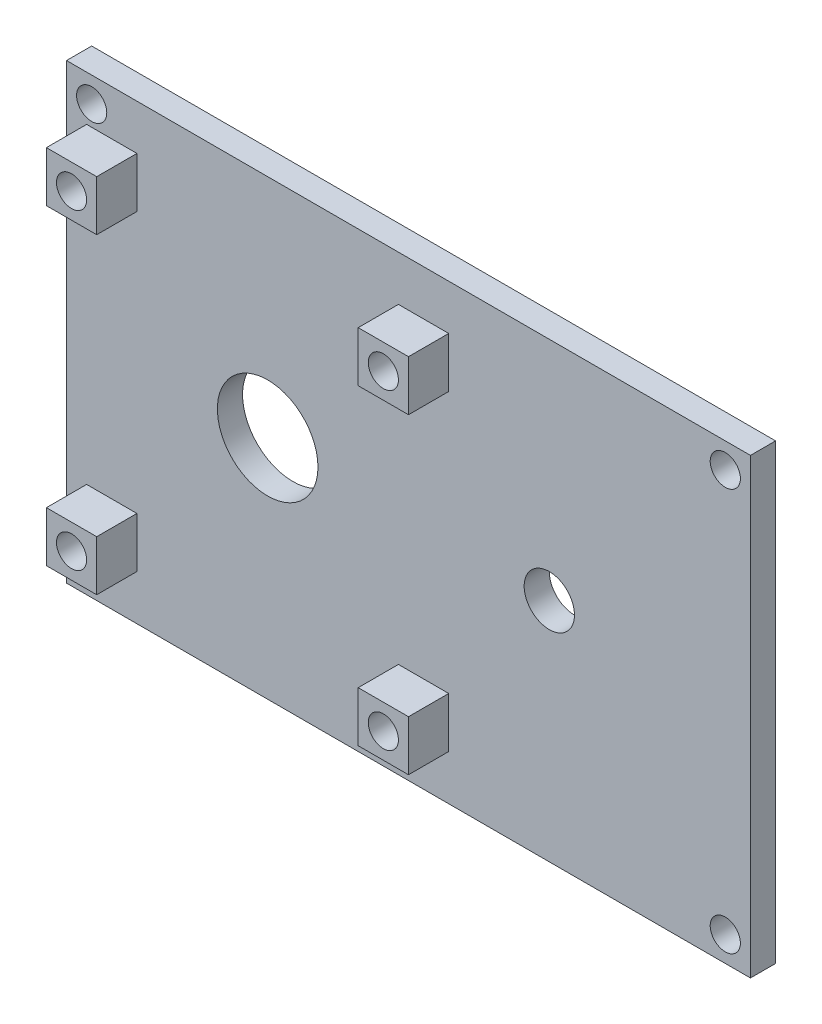
ISO-10303-21;
HEADER;
FILE_DESCRIPTION(('STEP AP214'),'2;1');
FILE_NAME('part.step','',(''),(''),'','','');
FILE_SCHEMA(('AUTOMOTIVE_DESIGN { 1 0 10303 214 1 1 1 1 }'));
ENDSEC;
DATA;
#1=APPLICATION_CONTEXT('core data for automotive mechanical design processes');
#2=APPLICATION_PROTOCOL_DEFINITION('international standard','automotive_design',2000,#1);
#3=PRODUCT_CONTEXT('',#1,'mechanical');
#4=PRODUCT('Part','Part','',(#3));
#5=PRODUCT_RELATED_PRODUCT_CATEGORY('part','',(#4));
#6=PRODUCT_DEFINITION_FORMATION('','',#4);
#7=PRODUCT_DEFINITION_CONTEXT('part definition',#1,'design');
#8=PRODUCT_DEFINITION('design','',#6,#7);
#9=PRODUCT_DEFINITION_SHAPE('','',#8);
#10=(LENGTH_UNIT() NAMED_UNIT(*) SI_UNIT(.MILLI.,.METRE.));
#11=(NAMED_UNIT(*) PLANE_ANGLE_UNIT() SI_UNIT($,.RADIAN.));
#12=(NAMED_UNIT(*) SI_UNIT($,.STERADIAN.) SOLID_ANGLE_UNIT());
#13=UNCERTAINTY_MEASURE_WITH_UNIT(LENGTH_MEASURE(1.E-05),#10,'distance_accuracy_value','');
#14=(GEOMETRIC_REPRESENTATION_CONTEXT(3) GLOBAL_UNCERTAINTY_ASSIGNED_CONTEXT((#13)) GLOBAL_UNIT_ASSIGNED_CONTEXT((#10,
#11,#12)) REPRESENTATION_CONTEXT('',''));
#15=CARTESIAN_POINT('',(0.,0.,0.));
#16=DIRECTION('',(0.,0.,1.));
#17=DIRECTION('',(1.,0.,0.));
#18=AXIS2_PLACEMENT_3D('',#15,#16,#17);
#19=CARTESIAN_POINT('',(0.,-22.5,2.5));
#20=DIRECTION('',(0.,1.,0.));
#21=DIRECTION('',(0.,0.,1.));
#22=AXIS2_PLACEMENT_3D('',#19,#20,#21);
#23=PLANE('',#22);
#24=DIRECTION('',(1.,0.,0.));
#25=VECTOR('',#24,1.);
#26=CARTESIAN_POINT('',(0.,-22.5,0.));
#27=LINE('',#26,#25);
#28=CARTESIAN_POINT('',(-34.,-22.5,0.));
#29=VERTEX_POINT('',#28);
#30=CARTESIAN_POINT('',(34.,-22.5,0.));
#31=VERTEX_POINT('',#30);
#32=EDGE_CURVE('E349',#29,#31,#27,.T.);
#33=ORIENTED_EDGE('',*,*,#32,.T.);
#34=DIRECTION('',(0.,0.,-1.));
#35=VECTOR('',#34,1.);
#36=CARTESIAN_POINT('',(34.,-22.5,2.5));
#37=LINE('',#36,#35);
#38=CARTESIAN_POINT('',(34.,-22.5,2.5));
#39=VERTEX_POINT('',#38);
#40=EDGE_CURVE('E365',#39,#31,#37,.T.);
#41=ORIENTED_EDGE('',*,*,#40,.F.);
#42=DIRECTION('',(1.,0.,0.));
#43=VECTOR('',#42,1.);
#44=CARTESIAN_POINT('',(0.,-22.5,2.5));
#45=LINE('',#44,#43);
#46=CARTESIAN_POINT('',(-34.,-22.5,2.5));
#47=VERTEX_POINT('',#46);
#48=EDGE_CURVE('E320',#47,#39,#45,.T.);
#49=ORIENTED_EDGE('',*,*,#48,.F.);
#50=DIRECTION('',(0.,0.,-1.));
#51=VECTOR('',#50,1.);
#52=CARTESIAN_POINT('',(-34.,-22.5,2.5));
#53=LINE('',#52,#51);
#54=EDGE_CURVE('E331',#47,#29,#53,.T.);
#55=ORIENTED_EDGE('',*,*,#54,.T.);
#56=EDGE_LOOP('',(#33,#41,#49,#55));
#57=FACE_BOUND('',#56,.T.);
#58=ADVANCED_FACE('F37',(#57),#23,.F.);
#59=CARTESIAN_POINT('',(34.,0.,2.5));
#60=DIRECTION('',(-1.,0.,0.));
#61=DIRECTION('',(0.,-1.,0.));
#62=AXIS2_PLACEMENT_3D('',#59,#60,#61);
#63=PLANE('',#62);
#64=DIRECTION('',(0.,1.,0.));
#65=VECTOR('',#64,1.);
#66=CARTESIAN_POINT('',(34.,0.,0.));
#67=LINE('',#66,#65);
#68=CARTESIAN_POINT('',(34.,22.5,0.));
#69=VERTEX_POINT('',#68);
#70=EDGE_CURVE('E352',#31,#69,#67,.T.);
#71=ORIENTED_EDGE('',*,*,#70,.T.);
#72=DIRECTION('',(0.,0.,-1.));
#73=VECTOR('',#72,1.);
#74=CARTESIAN_POINT('',(34.,22.5,2.5));
#75=LINE('',#74,#73);
#76=CARTESIAN_POINT('',(34.,22.5,2.5));
#77=VERTEX_POINT('',#76);
#78=EDGE_CURVE('E363',#77,#69,#75,.T.);
#79=ORIENTED_EDGE('',*,*,#78,.F.);
#80=DIRECTION('',(0.,1.,0.));
#81=VECTOR('',#80,1.);
#82=CARTESIAN_POINT('',(34.,0.,2.5));
#83=LINE('',#82,#81);
#84=EDGE_CURVE('E323',#39,#77,#83,.T.);
#85=ORIENTED_EDGE('',*,*,#84,.F.);
#86=ORIENTED_EDGE('',*,*,#40,.T.);
#87=EDGE_LOOP('',(#71,#79,#85,#86));
#88=FACE_BOUND('',#87,.T.);
#89=ADVANCED_FACE('F432',(#88),#63,.F.);
#90=CARTESIAN_POINT('',(0.,22.5,2.5));
#91=DIRECTION('',(0.,1.,0.));
#92=DIRECTION('',(-1.,0.,0.));
#93=AXIS2_PLACEMENT_3D('',#90,#91,#92);
#94=PLANE('',#93);
#95=DIRECTION('',(1.,0.,0.));
#96=VECTOR('',#95,1.);
#97=CARTESIAN_POINT('',(0.,22.5,0.));
#98=LINE('',#97,#96);
#99=CARTESIAN_POINT('',(-34.,22.5,0.));
#100=VERTEX_POINT('',#99);
#101=EDGE_CURVE('E355',#100,#69,#98,.T.);
#102=ORIENTED_EDGE('',*,*,#101,.F.);
#103=DIRECTION('',(0.,0.,-1.));
#104=VECTOR('',#103,1.);
#105=CARTESIAN_POINT('',(-34.,22.5,2.5));
#106=LINE('',#105,#104);
#107=CARTESIAN_POINT('',(-34.,22.5,2.5));
#108=VERTEX_POINT('',#107);
#109=EDGE_CURVE('E361',#108,#100,#106,.T.);
#110=ORIENTED_EDGE('',*,*,#109,.F.);
#111=DIRECTION('',(1.,0.,0.));
#112=VECTOR('',#111,1.);
#113=CARTESIAN_POINT('',(0.,22.5,2.5));
#114=LINE('',#113,#112);
#115=EDGE_CURVE('E325',#108,#77,#114,.T.);
#116=ORIENTED_EDGE('',*,*,#115,.T.);
#117=ORIENTED_EDGE('',*,*,#78,.T.);
#118=EDGE_LOOP('',(#102,#110,#116,#117));
#119=FACE_BOUND('',#118,.T.);
#120=ADVANCED_FACE('F429',(#119),#94,.T.);
#121=CARTESIAN_POINT('',(-31.5,20.,2.5));
#122=DIRECTION('',(0.,0.,-1.));
#123=DIRECTION('',(-1.,0.,0.));
#124=AXIS2_PLACEMENT_3D('',#121,#122,#123);
#125=CYLINDRICAL_SURFACE('',#124,1.5);
#126=CARTESIAN_POINT('',(-31.5,20.,2.5));
#127=DIRECTION('',(0.,0.,1.));
#128=DIRECTION('',(1.,0.,0.));
#129=AXIS2_PLACEMENT_3D('',#126,#127,#128);
#130=CIRCLE('',#129,1.5);
#131=CARTESIAN_POINT('',(-30.,20.,2.5));
#132=VERTEX_POINT('',#131);
#133=EDGE_CURVE('E317',#132,#132,#130,.T.);
#134=ORIENTED_EDGE('',*,*,#133,.T.);
#135=EDGE_LOOP('',(#134));
#136=FACE_BOUND('',#135,.T.);
#137=CARTESIAN_POINT('',(-31.5,20.,0.));
#138=DIRECTION('',(0.,0.,1.));
#139=DIRECTION('',(1.,0.,0.));
#140=AXIS2_PLACEMENT_3D('',#137,#138,#139);
#141=CIRCLE('',#140,1.5);
#142=CARTESIAN_POINT('',(-30.,20.,0.));
#143=VERTEX_POINT('',#142);
#144=EDGE_CURVE('E346',#143,#143,#141,.T.);
#145=ORIENTED_EDGE('',*,*,#144,.F.);
#146=EDGE_LOOP('',(#145));
#147=FACE_BOUND('',#146,.T.);
#148=ADVANCED_FACE('F452',(#136,#147),#125,.F.);
#149=CARTESIAN_POINT('',(31.5,20.,2.5));
#150=DIRECTION('',(0.,0.,-1.));
#151=DIRECTION('',(-1.,0.,0.));
#152=AXIS2_PLACEMENT_3D('',#149,#150,#151);
#153=CYLINDRICAL_SURFACE('',#152,1.5);
#154=CARTESIAN_POINT('',(31.5,20.,2.5));
#155=DIRECTION('',(0.,0.,1.));
#156=DIRECTION('',(1.,0.,0.));
#157=AXIS2_PLACEMENT_3D('',#154,#155,#156);
#158=CIRCLE('',#157,1.5);
#159=CARTESIAN_POINT('',(33.,20.,2.5));
#160=VERTEX_POINT('',#159);
#161=EDGE_CURVE('E314',#160,#160,#158,.T.);
#162=ORIENTED_EDGE('',*,*,#161,.T.);
#163=EDGE_LOOP('',(#162));
#164=FACE_BOUND('',#163,.T.);
#165=CARTESIAN_POINT('',(31.5,20.,0.));
#166=DIRECTION('',(0.,0.,1.));
#167=DIRECTION('',(1.,0.,0.));
#168=AXIS2_PLACEMENT_3D('',#165,#166,#167);
#169=CIRCLE('',#168,1.5);
#170=CARTESIAN_POINT('',(33.,20.,0.));
#171=VERTEX_POINT('',#170);
#172=EDGE_CURVE('E343',#171,#171,#169,.T.);
#173=ORIENTED_EDGE('',*,*,#172,.F.);
#174=EDGE_LOOP('',(#173));
#175=FACE_BOUND('',#174,.T.);
#176=ADVANCED_FACE('F455',(#164,#175),#153,.F.);
#177=CARTESIAN_POINT('',(31.5,-20.,2.5));
#178=DIRECTION('',(0.,0.,-1.));
#179=DIRECTION('',(-1.,0.,0.));
#180=AXIS2_PLACEMENT_3D('',#177,#178,#179);
#181=CYLINDRICAL_SURFACE('',#180,1.5);
#182=CARTESIAN_POINT('',(31.5,-20.,2.5));
#183=DIRECTION('',(0.,0.,1.));
#184=DIRECTION('',(1.,0.,0.));
#185=AXIS2_PLACEMENT_3D('',#182,#183,#184);
#186=CIRCLE('',#185,1.5);
#187=CARTESIAN_POINT('',(33.,-20.,2.5));
#188=VERTEX_POINT('',#187);
#189=EDGE_CURVE('E311',#188,#188,#186,.T.);
#190=ORIENTED_EDGE('',*,*,#189,.T.);
#191=EDGE_LOOP('',(#190));
#192=FACE_BOUND('',#191,.T.);
#193=CARTESIAN_POINT('',(31.5,-20.,0.));
#194=DIRECTION('',(0.,0.,1.));
#195=DIRECTION('',(1.,0.,0.));
#196=AXIS2_PLACEMENT_3D('',#193,#194,#195);
#197=CIRCLE('',#196,1.5);
#198=CARTESIAN_POINT('',(33.,-20.,0.));
#199=VERTEX_POINT('',#198);
#200=EDGE_CURVE('E340',#199,#199,#197,.T.);
#201=ORIENTED_EDGE('',*,*,#200,.F.);
#202=EDGE_LOOP('',(#201));
#203=FACE_BOUND('',#202,.T.);
#204=ADVANCED_FACE('F459',(#192,#203),#181,.F.);
#205=CARTESIAN_POINT('',(-31.5,-20.,2.5));
#206=DIRECTION('',(0.,0.,-1.));
#207=DIRECTION('',(-1.,0.,0.));
#208=AXIS2_PLACEMENT_3D('',#205,#206,#207);
#209=CYLINDRICAL_SURFACE('',#208,1.5);
#210=CARTESIAN_POINT('',(-31.5,-20.,2.5));
#211=DIRECTION('',(0.,0.,1.));
#212=DIRECTION('',(1.,0.,0.));
#213=AXIS2_PLACEMENT_3D('',#210,#211,#212);
#214=CIRCLE('',#213,1.5);
#215=CARTESIAN_POINT('',(-30.,-20.,2.5));
#216=VERTEX_POINT('',#215);
#217=EDGE_CURVE('E308',#216,#216,#214,.T.);
#218=ORIENTED_EDGE('',*,*,#217,.T.);
#219=EDGE_LOOP('',(#218));
#220=FACE_BOUND('',#219,.T.);
#221=CARTESIAN_POINT('',(-31.5,-20.,0.));
#222=DIRECTION('',(0.,0.,1.));
#223=DIRECTION('',(1.,0.,0.));
#224=AXIS2_PLACEMENT_3D('',#221,#222,#223);
#225=CIRCLE('',#224,1.5);
#226=CARTESIAN_POINT('',(-30.,-20.,0.));
#227=VERTEX_POINT('',#226);
#228=EDGE_CURVE('E337',#227,#227,#225,.T.);
#229=ORIENTED_EDGE('',*,*,#228,.F.);
#230=EDGE_LOOP('',(#229));
#231=FACE_BOUND('',#230,.T.);
#232=ADVANCED_FACE('F463',(#220,#231),#209,.F.);
#233=CARTESIAN_POINT('',(-14.,0.,2.5));
#234=DIRECTION('',(0.,0.,-1.));
#235=DIRECTION('',(-1.,0.,0.));
#236=AXIS2_PLACEMENT_3D('',#233,#234,#235);
#237=CYLINDRICAL_SURFACE('',#236,5.);
#238=CARTESIAN_POINT('',(-14.,0.,2.5));
#239=DIRECTION('',(0.,0.,1.));
#240=DIRECTION('',(1.,0.,0.));
#241=AXIS2_PLACEMENT_3D('',#238,#239,#240);
#242=CIRCLE('',#241,5.);
#243=CARTESIAN_POINT('',(-8.99999999999997,0.,2.5));
#244=VERTEX_POINT('',#243);
#245=EDGE_CURVE('E304',#244,#244,#242,.T.);
#246=ORIENTED_EDGE('',*,*,#245,.T.);
#247=EDGE_LOOP('',(#246));
#248=FACE_BOUND('',#247,.T.);
#249=CARTESIAN_POINT('',(-14.,0.,0.));
#250=DIRECTION('',(0.,0.,1.));
#251=DIRECTION('',(1.,0.,0.));
#252=AXIS2_PLACEMENT_3D('',#249,#250,#251);
#253=CIRCLE('',#252,5.);
#254=CARTESIAN_POINT('',(-8.99999999999997,0.,0.));
#255=VERTEX_POINT('',#254);
#256=EDGE_CURVE('E334',#255,#255,#253,.T.);
#257=ORIENTED_EDGE('',*,*,#256,.F.);
#258=EDGE_LOOP('',(#257));
#259=FACE_BOUND('',#258,.T.);
#260=ADVANCED_FACE('F467',(#248,#259),#237,.F.);
#261=CARTESIAN_POINT('',(14.,0.,2.5));
#262=DIRECTION('',(0.,0.,-1.));
#263=DIRECTION('',(-1.,0.,0.));
#264=AXIS2_PLACEMENT_3D('',#261,#262,#263);
#265=CYLINDRICAL_SURFACE('',#264,2.5);
#266=CARTESIAN_POINT('',(14.,0.,2.5));
#267=DIRECTION('',(0.,0.,1.));
#268=DIRECTION('',(1.,0.,0.));
#269=AXIS2_PLACEMENT_3D('',#266,#267,#268);
#270=CIRCLE('',#269,2.5);
#271=CARTESIAN_POINT('',(16.5,0.,2.5));
#272=VERTEX_POINT('',#271);
#273=EDGE_CURVE('E301',#272,#272,#270,.T.);
#274=ORIENTED_EDGE('',*,*,#273,.T.);
#275=EDGE_LOOP('',(#274));
#276=FACE_BOUND('',#275,.T.);
#277=CARTESIAN_POINT('',(14.,0.,0.));
#278=DIRECTION('',(0.,0.,1.));
#279=DIRECTION('',(1.,0.,0.));
#280=AXIS2_PLACEMENT_3D('',#277,#278,#279);
#281=CIRCLE('',#280,2.5);
#282=CARTESIAN_POINT('',(16.5,0.,0.));
#283=VERTEX_POINT('',#282);
#284=EDGE_CURVE('E300',#283,#283,#281,.T.);
#285=ORIENTED_EDGE('',*,*,#284,.F.);
#286=EDGE_LOOP('',(#285));
#287=FACE_BOUND('',#286,.T.);
#288=ADVANCED_FACE('F440',(#276,#287),#265,.F.);
#289=CARTESIAN_POINT('',(-34.,0.,2.5));
#290=DIRECTION('',(-1.,0.,0.));
#291=DIRECTION('',(0.,-1.,0.));
#292=AXIS2_PLACEMENT_3D('',#289,#290,#291);
#293=PLANE('',#292);
#294=DIRECTION('',(0.,1.,0.));
#295=VECTOR('',#294,1.);
#296=CARTESIAN_POINT('',(-34.,0.,0.));
#297=LINE('',#296,#295);
#298=EDGE_CURVE('E305',#29,#100,#297,.T.);
#299=ORIENTED_EDGE('',*,*,#298,.F.);
#300=ORIENTED_EDGE('',*,*,#54,.F.);
#301=DIRECTION('',(0.,1.,0.));
#302=VECTOR('',#301,1.);
#303=CARTESIAN_POINT('',(-34.,0.,2.5));
#304=LINE('',#303,#302);
#305=EDGE_CURVE('E328',#47,#108,#304,.T.);
#306=ORIENTED_EDGE('',*,*,#305,.T.);
#307=ORIENTED_EDGE('',*,*,#109,.T.);
#308=EDGE_LOOP('',(#299,#300,#306,#307));
#309=FACE_BOUND('',#308,.T.);
#310=ADVANCED_FACE('F423',(#309),#293,.T.);
#311=CARTESIAN_POINT('',(0.,0.,2.5));
#312=DIRECTION('',(0.,0.,1.));
#313=DIRECTION('',(1.,0.,0.));
#314=AXIS2_PLACEMENT_3D('',#311,#312,#313);
#315=PLANE('',#314);
#316=DIRECTION('',(-1.,0.,0.));
#317=VECTOR('',#316,1.);
#318=CARTESIAN_POINT('',(-32.,-13.,2.5));
#319=LINE('',#318,#317);
#320=CARTESIAN_POINT('',(-27.,-13.,2.5));
#321=VERTEX_POINT('',#320);
#322=CARTESIAN_POINT('',(-32.,-13.,2.5));
#323=VERTEX_POINT('',#322);
#324=EDGE_CURVE('E508',#321,#323,#319,.T.);
#325=ORIENTED_EDGE('',*,*,#324,.F.);
#326=DIRECTION('',(0.,1.,0.));
#327=VECTOR('',#326,1.);
#328=CARTESIAN_POINT('',(-27.,-13.,2.5));
#329=LINE('',#328,#327);
#330=CARTESIAN_POINT('',(-27.,-18.,2.5));
#331=VERTEX_POINT('',#330);
#332=EDGE_CURVE('E200',#331,#321,#329,.T.);
#333=ORIENTED_EDGE('',*,*,#332,.F.);
#334=DIRECTION('',(1.,0.,0.));
#335=VECTOR('',#334,1.);
#336=CARTESIAN_POINT('',(-32.,-18.,2.5));
#337=LINE('',#336,#335);
#338=CARTESIAN_POINT('',(-32.,-18.,2.5));
#339=VERTEX_POINT('',#338);
#340=EDGE_CURVE('E196',#339,#331,#337,.T.);
#341=ORIENTED_EDGE('',*,*,#340,.F.);
#342=DIRECTION('',(0.,-1.,0.));
#343=VECTOR('',#342,1.);
#344=CARTESIAN_POINT('',(-32.,-13.,2.5));
#345=LINE('',#344,#343);
#346=EDGE_CURVE('E515',#323,#339,#345,.T.);
#347=ORIENTED_EDGE('',*,*,#346,.F.);
#348=EDGE_LOOP('',(#325,#333,#341,#347));
#349=FACE_BOUND('',#348,.T.);
#350=DIRECTION('',(-1.,0.,0.));
#351=VECTOR('',#350,1.);
#352=CARTESIAN_POINT('',(-0.999999999999972,-13.,2.5));
#353=LINE('',#352,#351);
#354=CARTESIAN_POINT('',(4.00000000000003,-13.,2.5));
#355=VERTEX_POINT('',#354);
#356=CARTESIAN_POINT('',(-0.999999999999972,-13.,2.5));
#357=VERTEX_POINT('',#356);
#358=EDGE_CURVE('E223',#355,#357,#353,.T.);
#359=ORIENTED_EDGE('',*,*,#358,.F.);
#360=DIRECTION('',(0.,1.,0.));
#361=VECTOR('',#360,1.);
#362=CARTESIAN_POINT('',(4.00000000000003,-13.,2.5));
#363=LINE('',#362,#361);
#364=CARTESIAN_POINT('',(4.00000000000003,-18.,2.5));
#365=VERTEX_POINT('',#364);
#366=EDGE_CURVE('E205',#365,#355,#363,.T.);
#367=ORIENTED_EDGE('',*,*,#366,.F.);
#368=DIRECTION('',(1.,0.,0.));
#369=VECTOR('',#368,1.);
#370=CARTESIAN_POINT('',(-0.999999999999971,-18.,2.5));
#371=LINE('',#370,#369);
#372=CARTESIAN_POINT('',(-0.999999999999971,-18.,2.5));
#373=VERTEX_POINT('',#372);
#374=EDGE_CURVE('E214',#373,#365,#371,.T.);
#375=ORIENTED_EDGE('',*,*,#374,.F.);
#376=DIRECTION('',(0.,-1.,0.));
#377=VECTOR('',#376,1.);
#378=CARTESIAN_POINT('',(-0.999999999999972,-13.,2.5));
#379=LINE('',#378,#377);
#380=EDGE_CURVE('E225',#357,#373,#379,.T.);
#381=ORIENTED_EDGE('',*,*,#380,.F.);
#382=EDGE_LOOP('',(#359,#367,#375,#381));
#383=FACE_BOUND('',#382,.T.);
#384=DIRECTION('',(-1.,0.,0.));
#385=VECTOR('',#384,1.);
#386=CARTESIAN_POINT('',(-32.,18.,2.5));
#387=LINE('',#386,#385);
#388=CARTESIAN_POINT('',(-27.,18.,2.5));
#389=VERTEX_POINT('',#388);
#390=CARTESIAN_POINT('',(-32.,18.,2.5));
#391=VERTEX_POINT('',#390);
#392=EDGE_CURVE('E253',#389,#391,#387,.T.);
#393=ORIENTED_EDGE('',*,*,#392,.F.);
#394=DIRECTION('',(0.,1.,0.));
#395=VECTOR('',#394,1.);
#396=CARTESIAN_POINT('',(-27.,18.,2.5));
#397=LINE('',#396,#395);
#398=CARTESIAN_POINT('',(-27.,13.,2.5));
#399=VERTEX_POINT('',#398);
#400=EDGE_CURVE('E239',#399,#389,#397,.T.);
#401=ORIENTED_EDGE('',*,*,#400,.F.);
#402=DIRECTION('',(1.,0.,0.));
#403=VECTOR('',#402,1.);
#404=CARTESIAN_POINT('',(-32.,13.,2.5));
#405=LINE('',#404,#403);
#406=CARTESIAN_POINT('',(-32.,13.,2.5));
#407=VERTEX_POINT('',#406);
#408=EDGE_CURVE('E244',#407,#399,#405,.T.);
#409=ORIENTED_EDGE('',*,*,#408,.F.);
#410=DIRECTION('',(0.,-1.,0.));
#411=VECTOR('',#410,1.);
#412=CARTESIAN_POINT('',(-32.,18.,2.5));
#413=LINE('',#412,#411);
#414=EDGE_CURVE('E255',#391,#407,#413,.T.);
#415=ORIENTED_EDGE('',*,*,#414,.F.);
#416=EDGE_LOOP('',(#393,#401,#409,#415));
#417=FACE_BOUND('',#416,.T.);
#418=DIRECTION('',(-1.,0.,0.));
#419=VECTOR('',#418,1.);
#420=CARTESIAN_POINT('',(-0.999999999999972,18.,2.5));
#421=LINE('',#420,#419);
#422=CARTESIAN_POINT('',(4.00000000000003,18.,2.5));
#423=VERTEX_POINT('',#422);
#424=CARTESIAN_POINT('',(-0.999999999999972,18.,2.5));
#425=VERTEX_POINT('',#424);
#426=EDGE_CURVE('E285',#423,#425,#421,.T.);
#427=ORIENTED_EDGE('',*,*,#426,.F.);
#428=DIRECTION('',(0.,1.,0.));
#429=VECTOR('',#428,1.);
#430=CARTESIAN_POINT('',(4.00000000000003,18.,2.5));
#431=LINE('',#430,#429);
#432=CARTESIAN_POINT('',(4.00000000000003,13.,2.5));
#433=VERTEX_POINT('',#432);
#434=EDGE_CURVE('E271',#433,#423,#431,.T.);
#435=ORIENTED_EDGE('',*,*,#434,.F.);
#436=DIRECTION('',(1.,0.,0.));
#437=VECTOR('',#436,1.);
#438=CARTESIAN_POINT('',(-0.999999999999971,13.,2.5));
#439=LINE('',#438,#437);
#440=CARTESIAN_POINT('',(-0.999999999999971,13.,2.5));
#441=VERTEX_POINT('',#440);
#442=EDGE_CURVE('E276',#441,#433,#439,.T.);
#443=ORIENTED_EDGE('',*,*,#442,.F.);
#444=DIRECTION('',(0.,-1.,0.));
#445=VECTOR('',#444,1.);
#446=CARTESIAN_POINT('',(-0.999999999999972,18.,2.5));
#447=LINE('',#446,#445);
#448=EDGE_CURVE('E287',#425,#441,#447,.T.);
#449=ORIENTED_EDGE('',*,*,#448,.F.);
#450=EDGE_LOOP('',(#427,#435,#443,#449));
#451=FACE_BOUND('',#450,.T.);
#452=ORIENTED_EDGE('',*,*,#273,.F.);
#453=EDGE_LOOP('',(#452));
#454=FACE_BOUND('',#453,.T.);
#455=ORIENTED_EDGE('',*,*,#245,.F.);
#456=EDGE_LOOP('',(#455));
#457=FACE_BOUND('',#456,.T.);
#458=ORIENTED_EDGE('',*,*,#217,.F.);
#459=EDGE_LOOP('',(#458));
#460=FACE_BOUND('',#459,.T.);
#461=ORIENTED_EDGE('',*,*,#189,.F.);
#462=EDGE_LOOP('',(#461));
#463=FACE_BOUND('',#462,.T.);
#464=ORIENTED_EDGE('',*,*,#161,.F.);
#465=EDGE_LOOP('',(#464));
#466=FACE_BOUND('',#465,.T.);
#467=ORIENTED_EDGE('',*,*,#133,.F.);
#468=EDGE_LOOP('',(#467));
#469=FACE_BOUND('',#468,.T.);
#470=ORIENTED_EDGE('',*,*,#48,.T.);
#471=ORIENTED_EDGE('',*,*,#84,.T.);
#472=ORIENTED_EDGE('',*,*,#115,.F.);
#473=ORIENTED_EDGE('',*,*,#305,.F.);
#474=EDGE_LOOP('',(#470,#471,#472,#473));
#475=FACE_BOUND('',#474,.T.);
#476=ADVANCED_FACE('F401',(#349,#383,#417,#451,#454,#457,#460,#463,#466,#469,#475),#315,.T.);
#477=CARTESIAN_POINT('',(0.,0.,0.));
#478=DIRECTION('',(0.,0.,1.));
#479=DIRECTION('',(1.,0.,0.));
#480=AXIS2_PLACEMENT_3D('',#477,#478,#479);
#481=PLANE('',#480);
#482=CARTESIAN_POINT('',(1.50000000000003,-15.5,0.));
#483=DIRECTION('',(0.,0.,1.));
#484=DIRECTION('',(1.,0.,0.));
#485=AXIS2_PLACEMENT_3D('',#482,#483,#484);
#486=CIRCLE('',#485,3.);
#487=CARTESIAN_POINT('',(4.50000000000003,-15.5,0.));
#488=VERTEX_POINT('',#487);
#489=EDGE_CURVE('E377',#488,#488,#486,.T.);
#490=ORIENTED_EDGE('',*,*,#489,.T.);
#491=EDGE_LOOP('',(#490));
#492=FACE_BOUND('',#491,.T.);
#493=CARTESIAN_POINT('',(-29.5,-15.5,0.));
#494=DIRECTION('',(0.,0.,1.));
#495=DIRECTION('',(1.,0.,0.));
#496=AXIS2_PLACEMENT_3D('',#493,#494,#495);
#497=CIRCLE('',#496,2.99999999999999);
#498=CARTESIAN_POINT('',(-26.5,-15.5,0.));
#499=VERTEX_POINT('',#498);
#500=EDGE_CURVE('E374',#499,#499,#497,.T.);
#501=ORIENTED_EDGE('',*,*,#500,.T.);
#502=EDGE_LOOP('',(#501));
#503=FACE_BOUND('',#502,.T.);
#504=CARTESIAN_POINT('',(-29.5,15.5,0.));
#505=DIRECTION('',(0.,0.,1.));
#506=DIRECTION('',(1.,0.,0.));
#507=AXIS2_PLACEMENT_3D('',#504,#505,#506);
#508=CIRCLE('',#507,2.99999999999999);
#509=CARTESIAN_POINT('',(-26.5,15.5,0.));
#510=VERTEX_POINT('',#509);
#511=EDGE_CURVE('E371',#510,#510,#508,.T.);
#512=ORIENTED_EDGE('',*,*,#511,.T.);
#513=EDGE_LOOP('',(#512));
#514=FACE_BOUND('',#513,.T.);
#515=CARTESIAN_POINT('',(1.50000000000003,15.5,0.));
#516=DIRECTION('',(0.,0.,1.));
#517=DIRECTION('',(1.,0.,0.));
#518=AXIS2_PLACEMENT_3D('',#515,#516,#517);
#519=CIRCLE('',#518,3.);
#520=CARTESIAN_POINT('',(4.50000000000003,15.5,0.));
#521=VERTEX_POINT('',#520);
#522=EDGE_CURVE('E368',#521,#521,#519,.T.);
#523=ORIENTED_EDGE('',*,*,#522,.T.);
#524=EDGE_LOOP('',(#523));
#525=FACE_BOUND('',#524,.T.);
#526=ORIENTED_EDGE('',*,*,#284,.T.);
#527=EDGE_LOOP('',(#526));
#528=FACE_BOUND('',#527,.T.);
#529=ORIENTED_EDGE('',*,*,#256,.T.);
#530=EDGE_LOOP('',(#529));
#531=FACE_BOUND('',#530,.T.);
#532=ORIENTED_EDGE('',*,*,#228,.T.);
#533=EDGE_LOOP('',(#532));
#534=FACE_BOUND('',#533,.T.);
#535=ORIENTED_EDGE('',*,*,#200,.T.);
#536=EDGE_LOOP('',(#535));
#537=FACE_BOUND('',#536,.T.);
#538=ORIENTED_EDGE('',*,*,#172,.T.);
#539=EDGE_LOOP('',(#538));
#540=FACE_BOUND('',#539,.T.);
#541=ORIENTED_EDGE('',*,*,#144,.T.);
#542=EDGE_LOOP('',(#541));
#543=FACE_BOUND('',#542,.T.);
#544=ORIENTED_EDGE('',*,*,#32,.F.);
#545=ORIENTED_EDGE('',*,*,#298,.T.);
#546=ORIENTED_EDGE('',*,*,#101,.T.);
#547=ORIENTED_EDGE('',*,*,#70,.F.);
#548=EDGE_LOOP('',(#544,#545,#546,#547));
#549=FACE_BOUND('',#548,.T.);
#550=ADVANCED_FACE('F397',(#492,#503,#514,#525,#528,#531,#534,#537,#540,#543,#549),#481,.F.);
#551=CARTESIAN_POINT('',(0.,0.,6.5));
#552=DIRECTION('',(0.,0.,1.));
#553=DIRECTION('',(1.,0.,0.));
#554=AXIS2_PLACEMENT_3D('',#551,#552,#553);
#555=PLANE('',#554);
#556=DIRECTION('',(0.,1.,0.));
#557=VECTOR('',#556,1.);
#558=CARTESIAN_POINT('',(4.00000000000003,18.,6.5));
#559=LINE('',#558,#557);
#560=CARTESIAN_POINT('',(4.00000000000003,13.,6.5));
#561=VERTEX_POINT('',#560);
#562=CARTESIAN_POINT('',(4.00000000000003,18.,6.5));
#563=VERTEX_POINT('',#562);
#564=EDGE_CURVE('E272',#561,#563,#559,.T.);
#565=ORIENTED_EDGE('',*,*,#564,.T.);
#566=DIRECTION('',(-1.,0.,0.));
#567=VECTOR('',#566,1.);
#568=CARTESIAN_POINT('',(-0.999999999999972,18.,6.5));
#569=LINE('',#568,#567);
#570=CARTESIAN_POINT('',(-0.999999999999972,18.,6.5));
#571=VERTEX_POINT('',#570);
#572=EDGE_CURVE('E275',#563,#571,#569,.T.);
#573=ORIENTED_EDGE('',*,*,#572,.T.);
#574=DIRECTION('',(0.,-1.,0.));
#575=VECTOR('',#574,1.);
#576=CARTESIAN_POINT('',(-0.999999999999972,18.,6.5));
#577=LINE('',#576,#575);
#578=CARTESIAN_POINT('',(-0.999999999999971,13.,6.5));
#579=VERTEX_POINT('',#578);
#580=EDGE_CURVE('E278',#571,#579,#577,.T.);
#581=ORIENTED_EDGE('',*,*,#580,.T.);
#582=DIRECTION('',(1.,0.,0.));
#583=VECTOR('',#582,1.);
#584=CARTESIAN_POINT('',(-0.999999999999971,13.,6.5));
#585=LINE('',#584,#583);
#586=EDGE_CURVE('E280',#579,#561,#585,.T.);
#587=ORIENTED_EDGE('',*,*,#586,.T.);
#588=EDGE_LOOP('',(#565,#573,#581,#587));
#589=FACE_BOUND('',#588,.T.);
#590=CARTESIAN_POINT('',(1.50000000000003,15.5,6.5));
#591=DIRECTION('',(0.,0.,1.));
#592=DIRECTION('',(1.,0.,0.));
#593=AXIS2_PLACEMENT_3D('',#590,#591,#592);
#594=CIRCLE('',#593,1.5);
#595=CARTESIAN_POINT('',(3.00000000000003,15.5,6.5));
#596=VERTEX_POINT('',#595);
#597=EDGE_CURVE('E268',#596,#596,#594,.T.);
#598=ORIENTED_EDGE('',*,*,#597,.F.);
#599=EDGE_LOOP('',(#598));
#600=FACE_BOUND('',#599,.T.);
#601=ADVANCED_FACE('F400',(#589,#600),#555,.T.);
#602=CARTESIAN_POINT('',(4.00000000000003,18.,6.5));
#603=DIRECTION('',(-1.,0.,0.));
#604=DIRECTION('',(0.,-1.,0.));
#605=AXIS2_PLACEMENT_3D('',#602,#603,#604);
#606=PLANE('',#605);
#607=ORIENTED_EDGE('',*,*,#434,.T.);
#608=DIRECTION('',(0.,0.,-1.));
#609=VECTOR('',#608,1.);
#610=CARTESIAN_POINT('',(4.00000000000003,18.,6.5));
#611=LINE('',#610,#609);
#612=EDGE_CURVE('E298',#563,#423,#611,.T.);
#613=ORIENTED_EDGE('',*,*,#612,.F.);
#614=ORIENTED_EDGE('',*,*,#564,.F.);
#615=DIRECTION('',(0.,0.,-1.));
#616=VECTOR('',#615,1.);
#617=CARTESIAN_POINT('',(4.00000000000003,13.,6.5));
#618=LINE('',#617,#616);
#619=EDGE_CURVE('E282',#561,#433,#618,.T.);
#620=ORIENTED_EDGE('',*,*,#619,.T.);
#621=EDGE_LOOP('',(#607,#613,#614,#620));
#622=FACE_BOUND('',#621,.T.);
#623=ADVANCED_FACE('F586',(#622),#606,.F.);
#624=CARTESIAN_POINT('',(-0.999999999999972,18.,6.5));
#625=DIRECTION('',(0.,-1.,0.));
#626=DIRECTION('',(0.,0.,-1.));
#627=AXIS2_PLACEMENT_3D('',#624,#625,#626);
#628=PLANE('',#627);
#629=ORIENTED_EDGE('',*,*,#426,.T.);
#630=DIRECTION('',(0.,0.,-1.));
#631=VECTOR('',#630,1.);
#632=CARTESIAN_POINT('',(-0.999999999999972,18.,6.5));
#633=LINE('',#632,#631);
#634=EDGE_CURVE('E295',#571,#425,#633,.T.);
#635=ORIENTED_EDGE('',*,*,#634,.F.);
#636=ORIENTED_EDGE('',*,*,#572,.F.);
#637=ORIENTED_EDGE('',*,*,#612,.T.);
#638=EDGE_LOOP('',(#629,#635,#636,#637));
#639=FACE_BOUND('',#638,.T.);
#640=ADVANCED_FACE('F594',(#639),#628,.F.);
#641=CARTESIAN_POINT('',(-0.999999999999972,18.,6.5));
#642=DIRECTION('',(1.,0.,0.));
#643=DIRECTION('',(0.,1.,0.));
#644=AXIS2_PLACEMENT_3D('',#641,#642,#643);
#645=PLANE('',#644);
#646=ORIENTED_EDGE('',*,*,#448,.T.);
#647=DIRECTION('',(0.,0.,-1.));
#648=VECTOR('',#647,1.);
#649=CARTESIAN_POINT('',(-0.999999999999971,13.,6.5));
#650=LINE('',#649,#648);
#651=EDGE_CURVE('E293',#579,#441,#650,.T.);
#652=ORIENTED_EDGE('',*,*,#651,.F.);
#653=ORIENTED_EDGE('',*,*,#580,.F.);
#654=ORIENTED_EDGE('',*,*,#634,.T.);
#655=EDGE_LOOP('',(#646,#652,#653,#654));
#656=FACE_BOUND('',#655,.T.);
#657=ADVANCED_FACE('F590',(#656),#645,.F.);
#658=CARTESIAN_POINT('',(-0.999999999999971,13.,6.5));
#659=DIRECTION('',(0.,1.,0.));
#660=DIRECTION('',(0.,0.,1.));
#661=AXIS2_PLACEMENT_3D('',#658,#659,#660);
#662=PLANE('',#661);
#663=ORIENTED_EDGE('',*,*,#442,.T.);
#664=ORIENTED_EDGE('',*,*,#619,.F.);
#665=ORIENTED_EDGE('',*,*,#586,.F.);
#666=ORIENTED_EDGE('',*,*,#651,.T.);
#667=EDGE_LOOP('',(#663,#664,#665,#666));
#668=FACE_BOUND('',#667,.T.);
#669=ADVANCED_FACE('F582',(#668),#662,.F.);
#670=CARTESIAN_POINT('',(1.50000000000003,15.5,6.5));
#671=DIRECTION('',(0.,0.,-1.));
#672=DIRECTION('',(-1.,0.,0.));
#673=AXIS2_PLACEMENT_3D('',#670,#671,#672);
#674=CYLINDRICAL_SURFACE('',#673,1.5);
#675=CARTESIAN_POINT('',(1.50000000000003,15.5,1.5));
#676=DIRECTION('',(0.,0.,1.));
#677=DIRECTION('',(1.,0.,0.));
#678=AXIS2_PLACEMENT_3D('',#675,#676,#677);
#679=CIRCLE('',#678,1.5);
#680=CARTESIAN_POINT('',(3.00000000000003,15.5,1.5));
#681=VERTEX_POINT('',#680);
#682=EDGE_CURVE('E11',#681,#681,#679,.F.);
#683=ORIENTED_EDGE('',*,*,#682,.T.);
#684=EDGE_LOOP('',(#683));
#685=FACE_BOUND('',#684,.T.);
#686=ORIENTED_EDGE('',*,*,#597,.T.);
#687=EDGE_LOOP('',(#686));
#688=FACE_BOUND('',#687,.T.);
#689=ADVANCED_FACE('F564',(#685,#688),#674,.F.);
#690=CARTESIAN_POINT('',(0.,0.,6.5));
#691=DIRECTION('',(0.,0.,1.));
#692=DIRECTION('',(1.,0.,0.));
#693=AXIS2_PLACEMENT_3D('',#690,#691,#692);
#694=PLANE('',#693);
#695=DIRECTION('',(0.,1.,0.));
#696=VECTOR('',#695,1.);
#697=CARTESIAN_POINT('',(-27.,18.,6.5));
#698=LINE('',#697,#696);
#699=CARTESIAN_POINT('',(-27.,13.,6.5));
#700=VERTEX_POINT('',#699);
#701=CARTESIAN_POINT('',(-27.,18.,6.5));
#702=VERTEX_POINT('',#701);
#703=EDGE_CURVE('E240',#700,#702,#698,.T.);
#704=ORIENTED_EDGE('',*,*,#703,.T.);
#705=DIRECTION('',(-1.,0.,0.));
#706=VECTOR('',#705,1.);
#707=CARTESIAN_POINT('',(-32.,18.,6.5));
#708=LINE('',#707,#706);
#709=CARTESIAN_POINT('',(-32.,18.,6.5));
#710=VERTEX_POINT('',#709);
#711=EDGE_CURVE('E243',#702,#710,#708,.T.);
#712=ORIENTED_EDGE('',*,*,#711,.T.);
#713=DIRECTION('',(0.,-1.,0.));
#714=VECTOR('',#713,1.);
#715=CARTESIAN_POINT('',(-32.,18.,6.5));
#716=LINE('',#715,#714);
#717=CARTESIAN_POINT('',(-32.,13.,6.5));
#718=VERTEX_POINT('',#717);
#719=EDGE_CURVE('E246',#710,#718,#716,.T.);
#720=ORIENTED_EDGE('',*,*,#719,.T.);
#721=DIRECTION('',(1.,0.,0.));
#722=VECTOR('',#721,1.);
#723=CARTESIAN_POINT('',(-32.,13.,6.5));
#724=LINE('',#723,#722);
#725=EDGE_CURVE('E248',#718,#700,#724,.T.);
#726=ORIENTED_EDGE('',*,*,#725,.T.);
#727=EDGE_LOOP('',(#704,#712,#720,#726));
#728=FACE_BOUND('',#727,.T.);
#729=CARTESIAN_POINT('',(-29.5,15.5,6.5));
#730=DIRECTION('',(0.,0.,1.));
#731=DIRECTION('',(1.,0.,0.));
#732=AXIS2_PLACEMENT_3D('',#729,#730,#731);
#733=CIRCLE('',#732,1.5);
#734=CARTESIAN_POINT('',(-28.,15.5,6.5));
#735=VERTEX_POINT('',#734);
#736=EDGE_CURVE('E236',#735,#735,#733,.T.);
#737=ORIENTED_EDGE('',*,*,#736,.F.);
#738=EDGE_LOOP('',(#737));
#739=FACE_BOUND('',#738,.T.);
#740=ADVANCED_FACE('F560',(#728,#739),#694,.T.);
#741=CARTESIAN_POINT('',(-27.,18.,6.5));
#742=DIRECTION('',(-1.,0.,0.));
#743=DIRECTION('',(0.,0.,1.));
#744=AXIS2_PLACEMENT_3D('',#741,#742,#743);
#745=PLANE('',#744);
#746=ORIENTED_EDGE('',*,*,#400,.T.);
#747=DIRECTION('',(0.,0.,-1.));
#748=VECTOR('',#747,1.);
#749=CARTESIAN_POINT('',(-27.,18.,6.5));
#750=LINE('',#749,#748);
#751=EDGE_CURVE('E266',#702,#389,#750,.T.);
#752=ORIENTED_EDGE('',*,*,#751,.F.);
#753=ORIENTED_EDGE('',*,*,#703,.F.);
#754=DIRECTION('',(0.,0.,-1.));
#755=VECTOR('',#754,1.);
#756=CARTESIAN_POINT('',(-27.,13.,6.5));
#757=LINE('',#756,#755);
#758=EDGE_CURVE('E250',#700,#399,#757,.T.);
#759=ORIENTED_EDGE('',*,*,#758,.T.);
#760=EDGE_LOOP('',(#746,#752,#753,#759));
#761=FACE_BOUND('',#760,.T.);
#762=ADVANCED_FACE('F563',(#761),#745,.F.);
#763=CARTESIAN_POINT('',(-32.,18.,6.5));
#764=DIRECTION('',(0.,-1.,0.));
#765=DIRECTION('',(0.,0.,-1.));
#766=AXIS2_PLACEMENT_3D('',#763,#764,#765);
#767=PLANE('',#766);
#768=ORIENTED_EDGE('',*,*,#392,.T.);
#769=DIRECTION('',(0.,0.,-1.));
#770=VECTOR('',#769,1.);
#771=CARTESIAN_POINT('',(-32.,18.,6.5));
#772=LINE('',#771,#770);
#773=EDGE_CURVE('E263',#710,#391,#772,.T.);
#774=ORIENTED_EDGE('',*,*,#773,.F.);
#775=ORIENTED_EDGE('',*,*,#711,.F.);
#776=ORIENTED_EDGE('',*,*,#751,.T.);
#777=EDGE_LOOP('',(#768,#774,#775,#776));
#778=FACE_BOUND('',#777,.T.);
#779=ADVANCED_FACE('F572',(#778),#767,.F.);
#780=CARTESIAN_POINT('',(-32.,18.,6.5));
#781=DIRECTION('',(1.,0.,0.));
#782=DIRECTION('',(0.,0.,-1.));
#783=AXIS2_PLACEMENT_3D('',#780,#781,#782);
#784=PLANE('',#783);
#785=ORIENTED_EDGE('',*,*,#414,.T.);
#786=DIRECTION('',(0.,0.,-1.));
#787=VECTOR('',#786,1.);
#788=CARTESIAN_POINT('',(-32.,13.,6.5));
#789=LINE('',#788,#787);
#790=EDGE_CURVE('E261',#718,#407,#789,.T.);
#791=ORIENTED_EDGE('',*,*,#790,.F.);
#792=ORIENTED_EDGE('',*,*,#719,.F.);
#793=ORIENTED_EDGE('',*,*,#773,.T.);
#794=EDGE_LOOP('',(#785,#791,#792,#793));
#795=FACE_BOUND('',#794,.T.);
#796=ADVANCED_FACE('F568',(#795),#784,.F.);
#797=CARTESIAN_POINT('',(-32.,13.,6.5));
#798=DIRECTION('',(0.,1.,0.));
#799=DIRECTION('',(0.,0.,1.));
#800=AXIS2_PLACEMENT_3D('',#797,#798,#799);
#801=PLANE('',#800);
#802=ORIENTED_EDGE('',*,*,#408,.T.);
#803=ORIENTED_EDGE('',*,*,#758,.F.);
#804=ORIENTED_EDGE('',*,*,#725,.F.);
#805=ORIENTED_EDGE('',*,*,#790,.T.);
#806=EDGE_LOOP('',(#802,#803,#804,#805));
#807=FACE_BOUND('',#806,.T.);
#808=ADVANCED_FACE('F559',(#807),#801,.F.);
#809=CARTESIAN_POINT('',(-29.5,15.5,6.5));
#810=DIRECTION('',(0.,0.,-1.));
#811=DIRECTION('',(-1.,0.,0.));
#812=AXIS2_PLACEMENT_3D('',#809,#810,#811);
#813=CYLINDRICAL_SURFACE('',#812,1.5);
#814=CARTESIAN_POINT('',(-29.5,15.5,1.5));
#815=DIRECTION('',(0.,0.,1.));
#816=DIRECTION('',(1.,0.,0.));
#817=AXIS2_PLACEMENT_3D('',#814,#815,#816);
#818=CIRCLE('',#817,1.5);
#819=CARTESIAN_POINT('',(-28.,15.5,1.5));
#820=VERTEX_POINT('',#819);
#821=EDGE_CURVE('E46',#820,#820,#818,.F.);
#822=ORIENTED_EDGE('',*,*,#821,.T.);
#823=EDGE_LOOP('',(#822));
#824=FACE_BOUND('',#823,.T.);
#825=ORIENTED_EDGE('',*,*,#736,.T.);
#826=EDGE_LOOP('',(#825));
#827=FACE_BOUND('',#826,.T.);
#828=ADVANCED_FACE('F388',(#824,#827),#813,.F.);
#829=CARTESIAN_POINT('',(0.,0.,6.5));
#830=DIRECTION('',(0.,0.,1.));
#831=DIRECTION('',(1.,0.,0.));
#832=AXIS2_PLACEMENT_3D('',#829,#830,#831);
#833=PLANE('',#832);
#834=DIRECTION('',(0.,1.,0.));
#835=VECTOR('',#834,1.);
#836=CARTESIAN_POINT('',(4.00000000000003,-13.,6.5));
#837=LINE('',#836,#835);
#838=CARTESIAN_POINT('',(4.00000000000003,-18.,6.5));
#839=VERTEX_POINT('',#838);
#840=CARTESIAN_POINT('',(4.00000000000003,-13.,6.5));
#841=VERTEX_POINT('',#840);
#842=EDGE_CURVE('E210',#839,#841,#837,.T.);
#843=ORIENTED_EDGE('',*,*,#842,.T.);
#844=DIRECTION('',(-1.,0.,0.));
#845=VECTOR('',#844,1.);
#846=CARTESIAN_POINT('',(-0.999999999999972,-13.,6.5));
#847=LINE('',#846,#845);
#848=CARTESIAN_POINT('',(-0.999999999999972,-13.,6.5));
#849=VERTEX_POINT('',#848);
#850=EDGE_CURVE('E213',#841,#849,#847,.T.);
#851=ORIENTED_EDGE('',*,*,#850,.T.);
#852=DIRECTION('',(0.,-1.,0.));
#853=VECTOR('',#852,1.);
#854=CARTESIAN_POINT('',(-0.999999999999972,-13.,6.5));
#855=LINE('',#854,#853);
#856=CARTESIAN_POINT('',(-0.999999999999971,-18.,6.5));
#857=VERTEX_POINT('',#856);
#858=EDGE_CURVE('E216',#849,#857,#855,.T.);
#859=ORIENTED_EDGE('',*,*,#858,.T.);
#860=DIRECTION('',(1.,0.,0.));
#861=VECTOR('',#860,1.);
#862=CARTESIAN_POINT('',(-0.999999999999971,-18.,6.5));
#863=LINE('',#862,#861);
#864=EDGE_CURVE('E218',#857,#839,#863,.T.);
#865=ORIENTED_EDGE('',*,*,#864,.T.);
#866=EDGE_LOOP('',(#843,#851,#859,#865));
#867=FACE_BOUND('',#866,.T.);
#868=CARTESIAN_POINT('',(1.50000000000003,-15.5,6.5));
#869=DIRECTION('',(0.,0.,1.));
#870=DIRECTION('',(1.,0.,0.));
#871=AXIS2_PLACEMENT_3D('',#868,#869,#870);
#872=CIRCLE('',#871,1.5);
#873=CARTESIAN_POINT('',(3.00000000000003,-15.5,6.5));
#874=VERTEX_POINT('',#873);
#875=EDGE_CURVE('E202',#874,#874,#872,.T.);
#876=ORIENTED_EDGE('',*,*,#875,.F.);
#877=EDGE_LOOP('',(#876));
#878=FACE_BOUND('',#877,.T.);
#879=ADVANCED_FACE('F539',(#867,#878),#833,.T.);
#880=CARTESIAN_POINT('',(4.00000000000003,-13.,6.5));
#881=DIRECTION('',(-1.,0.,0.));
#882=DIRECTION('',(0.,-1.,0.));
#883=AXIS2_PLACEMENT_3D('',#880,#881,#882);
#884=PLANE('',#883);
#885=ORIENTED_EDGE('',*,*,#366,.T.);
#886=DIRECTION('',(0.,0.,-1.));
#887=VECTOR('',#886,1.);
#888=CARTESIAN_POINT('',(4.00000000000003,-13.,6.5));
#889=LINE('',#888,#887);
#890=EDGE_CURVE('E234',#841,#355,#889,.T.);
#891=ORIENTED_EDGE('',*,*,#890,.F.);
#892=ORIENTED_EDGE('',*,*,#842,.F.);
#893=DIRECTION('',(0.,0.,-1.));
#894=VECTOR('',#893,1.);
#895=CARTESIAN_POINT('',(4.00000000000003,-18.,6.5));
#896=LINE('',#895,#894);
#897=EDGE_CURVE('E220',#839,#365,#896,.T.);
#898=ORIENTED_EDGE('',*,*,#897,.T.);
#899=EDGE_LOOP('',(#885,#891,#892,#898));
#900=FACE_BOUND('',#899,.T.);
#901=ADVANCED_FACE('F542',(#900),#884,.F.);
#902=CARTESIAN_POINT('',(-0.999999999999972,-13.,6.5));
#903=DIRECTION('',(0.,-1.,0.));
#904=DIRECTION('',(0.,0.,-1.));
#905=AXIS2_PLACEMENT_3D('',#902,#903,#904);
#906=PLANE('',#905);
#907=ORIENTED_EDGE('',*,*,#358,.T.);
#908=DIRECTION('',(0.,0.,-1.));
#909=VECTOR('',#908,1.);
#910=CARTESIAN_POINT('',(-0.999999999999972,-13.,6.5));
#911=LINE('',#910,#909);
#912=EDGE_CURVE('E231',#849,#357,#911,.T.);
#913=ORIENTED_EDGE('',*,*,#912,.F.);
#914=ORIENTED_EDGE('',*,*,#850,.F.);
#915=ORIENTED_EDGE('',*,*,#890,.T.);
#916=EDGE_LOOP('',(#907,#913,#914,#915));
#917=FACE_BOUND('',#916,.T.);
#918=ADVANCED_FACE('F549',(#917),#906,.F.);
#919=CARTESIAN_POINT('',(-0.999999999999972,-13.,6.5));
#920=DIRECTION('',(1.,0.,0.));
#921=DIRECTION('',(0.,1.,0.));
#922=AXIS2_PLACEMENT_3D('',#919,#920,#921);
#923=PLANE('',#922);
#924=ORIENTED_EDGE('',*,*,#380,.T.);
#925=DIRECTION('',(0.,0.,-1.));
#926=VECTOR('',#925,1.);
#927=CARTESIAN_POINT('',(-0.999999999999971,-18.,6.5));
#928=LINE('',#927,#926);
#929=EDGE_CURVE('E61',#857,#373,#928,.T.);
#930=ORIENTED_EDGE('',*,*,#929,.F.);
#931=ORIENTED_EDGE('',*,*,#858,.F.);
#932=ORIENTED_EDGE('',*,*,#912,.T.);
#933=EDGE_LOOP('',(#924,#930,#931,#932));
#934=FACE_BOUND('',#933,.T.);
#935=ADVANCED_FACE('F546',(#934),#923,.F.);
#936=CARTESIAN_POINT('',(-0.999999999999971,-18.,6.5));
#937=DIRECTION('',(0.,1.,0.));
#938=DIRECTION('',(0.,0.,1.));
#939=AXIS2_PLACEMENT_3D('',#936,#937,#938);
#940=PLANE('',#939);
#941=ORIENTED_EDGE('',*,*,#374,.T.);
#942=ORIENTED_EDGE('',*,*,#897,.F.);
#943=ORIENTED_EDGE('',*,*,#864,.F.);
#944=ORIENTED_EDGE('',*,*,#929,.T.);
#945=EDGE_LOOP('',(#941,#942,#943,#944));
#946=FACE_BOUND('',#945,.T.);
#947=ADVANCED_FACE('F537',(#946),#940,.F.);
#948=CARTESIAN_POINT('',(1.50000000000003,-15.5,6.5));
#949=DIRECTION('',(0.,0.,-1.));
#950=DIRECTION('',(-1.,0.,0.));
#951=AXIS2_PLACEMENT_3D('',#948,#949,#950);
#952=CYLINDRICAL_SURFACE('',#951,1.5);
#953=CARTESIAN_POINT('',(1.50000000000003,-15.5,1.5));
#954=DIRECTION('',(0.,0.,1.));
#955=DIRECTION('',(1.,0.,0.));
#956=AXIS2_PLACEMENT_3D('',#953,#954,#955);
#957=CIRCLE('',#956,1.5);
#958=CARTESIAN_POINT('',(3.00000000000003,-15.5,1.5));
#959=VERTEX_POINT('',#958);
#960=EDGE_CURVE('E380',#959,#959,#957,.F.);
#961=ORIENTED_EDGE('',*,*,#960,.T.);
#962=EDGE_LOOP('',(#961));
#963=FACE_BOUND('',#962,.T.);
#964=ORIENTED_EDGE('',*,*,#875,.T.);
#965=EDGE_LOOP('',(#964));
#966=FACE_BOUND('',#965,.T.);
#967=ADVANCED_FACE('F534',(#963,#966),#952,.F.);
#968=CARTESIAN_POINT('',(0.,0.,6.5));
#969=DIRECTION('',(0.,0.,1.));
#970=DIRECTION('',(1.,0.,0.));
#971=AXIS2_PLACEMENT_3D('',#968,#969,#970);
#972=PLANE('',#971);
#973=DIRECTION('',(0.,1.,0.));
#974=VECTOR('',#973,1.);
#975=CARTESIAN_POINT('',(-27.,-13.,6.5));
#976=LINE('',#975,#974);
#977=CARTESIAN_POINT('',(-27.,-18.,6.5));
#978=VERTEX_POINT('',#977);
#979=CARTESIAN_POINT('',(-27.,-13.,6.5));
#980=VERTEX_POINT('',#979);
#981=EDGE_CURVE('E187',#978,#980,#976,.T.);
#982=ORIENTED_EDGE('',*,*,#981,.T.);
#983=DIRECTION('',(-1.,0.,0.));
#984=VECTOR('',#983,1.);
#985=CARTESIAN_POINT('',(-32.,-13.,6.5));
#986=LINE('',#985,#984);
#987=CARTESIAN_POINT('',(-32.,-13.,6.5));
#988=VERTEX_POINT('',#987);
#989=EDGE_CURVE('E176',#980,#988,#986,.T.);
#990=ORIENTED_EDGE('',*,*,#989,.T.);
#991=DIRECTION('',(0.,-1.,0.));
#992=VECTOR('',#991,1.);
#993=CARTESIAN_POINT('',(-32.,-13.,6.5));
#994=LINE('',#993,#992);
#995=CARTESIAN_POINT('',(-32.,-18.,6.5));
#996=VERTEX_POINT('',#995);
#997=EDGE_CURVE('E186',#988,#996,#994,.T.);
#998=ORIENTED_EDGE('',*,*,#997,.T.);
#999=DIRECTION('',(1.,0.,0.));
#1000=VECTOR('',#999,1.);
#1001=CARTESIAN_POINT('',(-32.,-18.,6.5));
#1002=LINE('',#1001,#1000);
#1003=EDGE_CURVE('E192',#996,#978,#1002,.T.);
#1004=ORIENTED_EDGE('',*,*,#1003,.T.);
#1005=EDGE_LOOP('',(#982,#990,#998,#1004));
#1006=FACE_BOUND('',#1005,.T.);
#1007=CARTESIAN_POINT('',(-29.5,-15.5,6.5));
#1008=DIRECTION('',(0.,0.,1.));
#1009=DIRECTION('',(1.,0.,0.));
#1010=AXIS2_PLACEMENT_3D('',#1007,#1008,#1009);
#1011=CIRCLE('',#1010,1.5);
#1012=CARTESIAN_POINT('',(-28.,-15.5,6.5));
#1013=VERTEX_POINT('',#1012);
#1014=EDGE_CURVE('E506',#1013,#1013,#1011,.T.);
#1015=ORIENTED_EDGE('',*,*,#1014,.F.);
#1016=EDGE_LOOP('',(#1015));
#1017=FACE_BOUND('',#1016,.T.);
#1018=ADVANCED_FACE('F190',(#1006,#1017),#972,.T.);
#1019=CARTESIAN_POINT('',(-27.,-13.,6.5));
#1020=DIRECTION('',(-1.,0.,0.));
#1021=DIRECTION('',(0.,0.,1.));
#1022=AXIS2_PLACEMENT_3D('',#1019,#1020,#1021);
#1023=PLANE('',#1022);
#1024=ORIENTED_EDGE('',*,*,#332,.T.);
#1025=DIRECTION('',(0.,0.,-1.));
#1026=VECTOR('',#1025,1.);
#1027=CARTESIAN_POINT('',(-27.,-13.,6.5));
#1028=LINE('',#1027,#1026);
#1029=EDGE_CURVE('E180',#980,#321,#1028,.T.);
#1030=ORIENTED_EDGE('',*,*,#1029,.F.);
#1031=ORIENTED_EDGE('',*,*,#981,.F.);
#1032=DIRECTION('',(0.,0.,-1.));
#1033=VECTOR('',#1032,1.);
#1034=CARTESIAN_POINT('',(-27.,-18.,6.5));
#1035=LINE('',#1034,#1033);
#1036=EDGE_CURVE('E512',#978,#331,#1035,.T.);
#1037=ORIENTED_EDGE('',*,*,#1036,.T.);
#1038=EDGE_LOOP('',(#1024,#1030,#1031,#1037));
#1039=FACE_BOUND('',#1038,.T.);
#1040=ADVANCED_FACE('F198',(#1039),#1023,.F.);
#1041=CARTESIAN_POINT('',(-32.,-13.,6.5));
#1042=DIRECTION('',(0.,-1.,0.));
#1043=DIRECTION('',(0.,0.,-1.));
#1044=AXIS2_PLACEMENT_3D('',#1041,#1042,#1043);
#1045=PLANE('',#1044);
#1046=ORIENTED_EDGE('',*,*,#324,.T.);
#1047=DIRECTION('',(0.,0.,-1.));
#1048=VECTOR('',#1047,1.);
#1049=CARTESIAN_POINT('',(-32.,-13.,6.5));
#1050=LINE('',#1049,#1048);
#1051=EDGE_CURVE('E183',#988,#323,#1050,.T.);
#1052=ORIENTED_EDGE('',*,*,#1051,.F.);
#1053=ORIENTED_EDGE('',*,*,#989,.F.);
#1054=ORIENTED_EDGE('',*,*,#1029,.T.);
#1055=EDGE_LOOP('',(#1046,#1052,#1053,#1054));
#1056=FACE_BOUND('',#1055,.T.);
#1057=ADVANCED_FACE('F178',(#1056),#1045,.F.);
#1058=CARTESIAN_POINT('',(-32.,-13.,6.5));
#1059=DIRECTION('',(1.,0.,0.));
#1060=DIRECTION('',(0.,0.,-1.));
#1061=AXIS2_PLACEMENT_3D('',#1058,#1059,#1060);
#1062=PLANE('',#1061);
#1063=ORIENTED_EDGE('',*,*,#346,.T.);
#1064=DIRECTION('',(0.,0.,-1.));
#1065=VECTOR('',#1064,1.);
#1066=CARTESIAN_POINT('',(-32.,-18.,6.5));
#1067=LINE('',#1066,#1065);
#1068=EDGE_CURVE('E53',#996,#339,#1067,.T.);
#1069=ORIENTED_EDGE('',*,*,#1068,.F.);
#1070=ORIENTED_EDGE('',*,*,#997,.F.);
#1071=ORIENTED_EDGE('',*,*,#1051,.T.);
#1072=EDGE_LOOP('',(#1063,#1069,#1070,#1071));
#1073=FACE_BOUND('',#1072,.T.);
#1074=ADVANCED_FACE('F521',(#1073),#1062,.F.);
#1075=CARTESIAN_POINT('',(-32.,-18.,6.5));
#1076=DIRECTION('',(0.,1.,0.));
#1077=DIRECTION('',(0.,0.,1.));
#1078=AXIS2_PLACEMENT_3D('',#1075,#1076,#1077);
#1079=PLANE('',#1078);
#1080=ORIENTED_EDGE('',*,*,#340,.T.);
#1081=ORIENTED_EDGE('',*,*,#1036,.F.);
#1082=ORIENTED_EDGE('',*,*,#1003,.F.);
#1083=ORIENTED_EDGE('',*,*,#1068,.T.);
#1084=EDGE_LOOP('',(#1080,#1081,#1082,#1083));
#1085=FACE_BOUND('',#1084,.T.);
#1086=ADVANCED_FACE('F502',(#1085),#1079,.F.);
#1087=CARTESIAN_POINT('',(-29.5,-15.5,6.5));
#1088=DIRECTION('',(0.,0.,-1.));
#1089=DIRECTION('',(-1.,0.,0.));
#1090=AXIS2_PLACEMENT_3D('',#1087,#1088,#1089);
#1091=CYLINDRICAL_SURFACE('',#1090,1.5);
#1092=CARTESIAN_POINT('',(-29.5,-15.5,1.5));
#1093=DIRECTION('',(0.,0.,1.));
#1094=DIRECTION('',(1.,0.,0.));
#1095=AXIS2_PLACEMENT_3D('',#1092,#1093,#1094);
#1096=CIRCLE('',#1095,1.5);
#1097=CARTESIAN_POINT('',(-28.,-15.5,1.5));
#1098=VERTEX_POINT('',#1097);
#1099=EDGE_CURVE('E383',#1098,#1098,#1096,.F.);
#1100=ORIENTED_EDGE('',*,*,#1099,.T.);
#1101=EDGE_LOOP('',(#1100));
#1102=FACE_BOUND('',#1101,.T.);
#1103=ORIENTED_EDGE('',*,*,#1014,.T.);
#1104=EDGE_LOOP('',(#1103));
#1105=FACE_BOUND('',#1104,.T.);
#1106=ADVANCED_FACE('F482',(#1102,#1105),#1091,.F.);
#1107=CARTESIAN_POINT('',(1.50000000000003,-15.5,0.));
#1108=DIRECTION('',(0.,0.,-1.));
#1109=DIRECTION('',(-1.,0.,0.));
#1110=AXIS2_PLACEMENT_3D('',#1107,#1108,#1109);
#1111=CONICAL_SURFACE('',#1110,3.,0.785398163397448);
#1112=ORIENTED_EDGE('',*,*,#960,.F.);
#1113=EDGE_LOOP('',(#1112));
#1114=FACE_BOUND('',#1113,.T.);
#1115=ORIENTED_EDGE('',*,*,#489,.F.);
#1116=EDGE_LOOP('',(#1115));
#1117=FACE_BOUND('',#1116,.T.);
#1118=ADVANCED_FACE('F476',(#1114,#1117),#1111,.F.);
#1119=CARTESIAN_POINT('',(-29.5,-15.5,0.));
#1120=DIRECTION('',(0.,0.,-1.));
#1121=DIRECTION('',(-1.,0.,0.));
#1122=AXIS2_PLACEMENT_3D('',#1119,#1120,#1121);
#1123=CONICAL_SURFACE('',#1122,2.99999999999999,0.785398163397445);
#1124=ORIENTED_EDGE('',*,*,#1099,.F.);
#1125=EDGE_LOOP('',(#1124));
#1126=FACE_BOUND('',#1125,.T.);
#1127=ORIENTED_EDGE('',*,*,#500,.F.);
#1128=EDGE_LOOP('',(#1127));
#1129=FACE_BOUND('',#1128,.T.);
#1130=ADVANCED_FACE('F394',(#1126,#1129),#1123,.F.);
#1131=CARTESIAN_POINT('',(-29.5,15.5,0.));
#1132=DIRECTION('',(0.,0.,-1.));
#1133=DIRECTION('',(-1.,0.,0.));
#1134=AXIS2_PLACEMENT_3D('',#1131,#1132,#1133);
#1135=CONICAL_SURFACE('',#1134,2.99999999999999,0.785398163397445);
#1136=ORIENTED_EDGE('',*,*,#821,.F.);
#1137=EDGE_LOOP('',(#1136));
#1138=FACE_BOUND('',#1137,.T.);
#1139=ORIENTED_EDGE('',*,*,#511,.F.);
#1140=EDGE_LOOP('',(#1139));
#1141=FACE_BOUND('',#1140,.T.);
#1142=ADVANCED_FACE('F391',(#1138,#1141),#1135,.F.);
#1143=CARTESIAN_POINT('',(1.50000000000003,15.5,0.));
#1144=DIRECTION('',(0.,0.,-1.));
#1145=DIRECTION('',(-1.,0.,0.));
#1146=AXIS2_PLACEMENT_3D('',#1143,#1144,#1145);
#1147=CONICAL_SURFACE('',#1146,3.,0.785398163397448);
#1148=ORIENTED_EDGE('',*,*,#682,.F.);
#1149=EDGE_LOOP('',(#1148));
#1150=FACE_BOUND('',#1149,.T.);
#1151=ORIENTED_EDGE('',*,*,#522,.F.);
#1152=EDGE_LOOP('',(#1151));
#1153=FACE_BOUND('',#1152,.T.);
#1154=ADVANCED_FACE('F40',(#1150,#1153),#1147,.F.);
#1155=CLOSED_SHELL('',(#58,#89,#120,#148,#176,#204,#232,#260,#288,#310,#476,#550,#601,#623,#640,
#657,#669,#689,#740,#762,#779,#796,#808,#828,#879,#901,#918,#935,#947,#967,#1018,#1040,#1057,
#1074,#1086,#1106,#1118,#1130,#1142,#1154));
#1156=MANIFOLD_SOLID_BREP('B2',#1155);
#1157=ADVANCED_BREP_SHAPE_REPRESENTATION('',(#18,#1156),#14);
#1158=SHAPE_DEFINITION_REPRESENTATION(#9,#1157);
ENDSEC;
END-ISO-10303-21;
